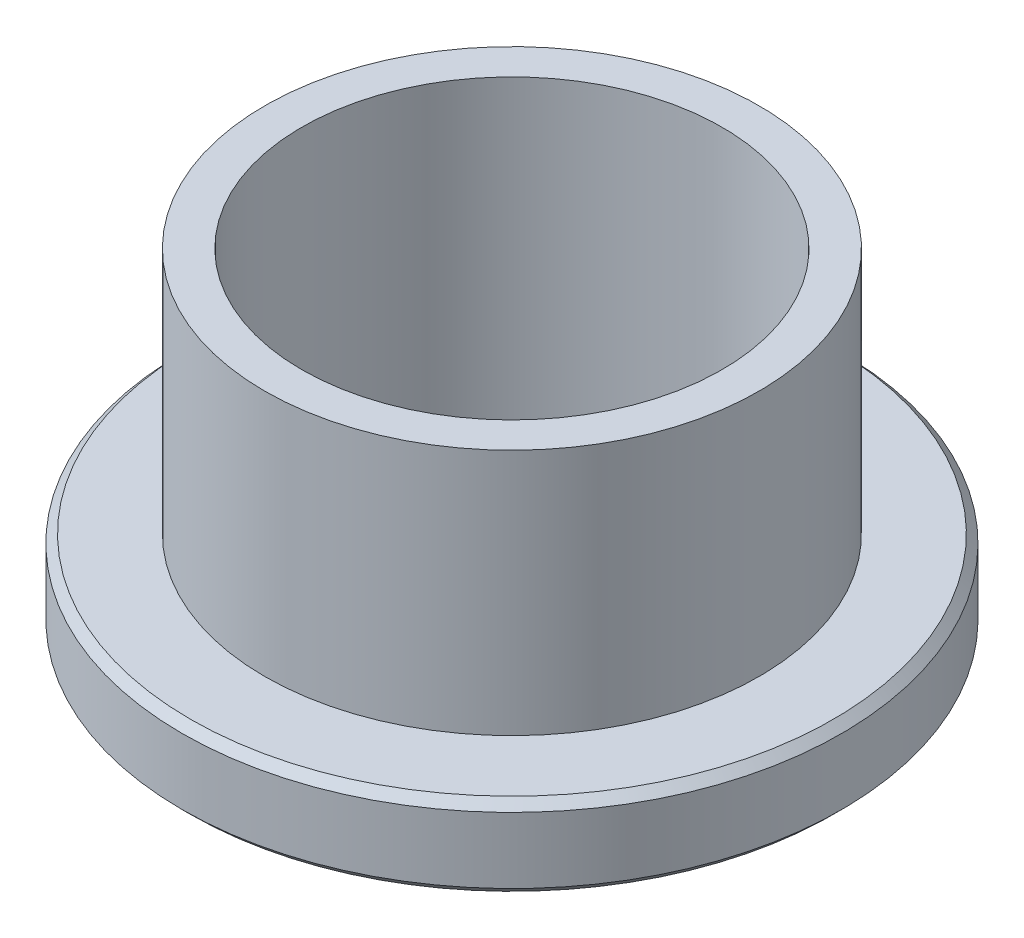
ISO-10303-21;
HEADER;
FILE_DESCRIPTION(('STEP AP214'),'2;1');
FILE_NAME('part.step','',(''),(''),'','','');
FILE_SCHEMA(('AUTOMOTIVE_DESIGN { 1 0 10303 214 1 1 1 1 }'));
ENDSEC;
DATA;
#1=APPLICATION_CONTEXT('core data for automotive mechanical design processes');
#2=APPLICATION_PROTOCOL_DEFINITION('international standard','automotive_design',2000,#1);
#3=PRODUCT_CONTEXT('',#1,'mechanical');
#4=PRODUCT('Part','Part','',(#3));
#5=PRODUCT_RELATED_PRODUCT_CATEGORY('part','',(#4));
#6=PRODUCT_DEFINITION_FORMATION('','',#4);
#7=PRODUCT_DEFINITION_CONTEXT('part definition',#1,'design');
#8=PRODUCT_DEFINITION('design','',#6,#7);
#9=PRODUCT_DEFINITION_SHAPE('','',#8);
#10=(LENGTH_UNIT() NAMED_UNIT(*) SI_UNIT(.MILLI.,.METRE.));
#11=(NAMED_UNIT(*) PLANE_ANGLE_UNIT() SI_UNIT($,.RADIAN.));
#12=(NAMED_UNIT(*) SI_UNIT($,.STERADIAN.) SOLID_ANGLE_UNIT());
#13=UNCERTAINTY_MEASURE_WITH_UNIT(LENGTH_MEASURE(1.E-05),#10,'distance_accuracy_value','');
#14=(GEOMETRIC_REPRESENTATION_CONTEXT(3) GLOBAL_UNCERTAINTY_ASSIGNED_CONTEXT((#13)) GLOBAL_UNIT_ASSIGNED_CONTEXT((#10,
#11,#12)) REPRESENTATION_CONTEXT('',''));
#15=CARTESIAN_POINT('',(0.,0.,0.));
#16=DIRECTION('',(0.,0.,1.));
#17=DIRECTION('',(1.,0.,0.));
#18=AXIS2_PLACEMENT_3D('',#15,#16,#17);
#19=CARTESIAN_POINT('',(0.,0.1,0.));
#20=DIRECTION('',(0.,1.,0.));
#21=DIRECTION('',(0.,0.,1.));
#22=AXIS2_PLACEMENT_3D('',#19,#20,#21);
#23=CONICAL_SURFACE('',#22,4.,0.785398163397448);
#24=CARTESIAN_POINT('',(0.,0.,0.));
#25=DIRECTION('',(0.,-1.,0.));
#26=DIRECTION('',(0.,0.,1.));
#27=AXIS2_PLACEMENT_3D('',#24,#25,#26);
#28=CIRCLE('',#27,3.9);
#29=CARTESIAN_POINT('',(0.,0.,3.9));
#30=VERTEX_POINT('',#29);
#31=EDGE_CURVE('E67',#30,#30,#28,.T.);
#32=ORIENTED_EDGE('',*,*,#31,.F.);
#33=EDGE_LOOP('',(#32));
#34=FACE_BOUND('',#33,.T.);
#35=CARTESIAN_POINT('',(0.,0.1,0.));
#36=DIRECTION('',(0.,1.,0.));
#37=DIRECTION('',(0.,0.,1.));
#38=AXIS2_PLACEMENT_3D('',#35,#36,#37);
#39=CIRCLE('',#38,4.);
#40=CARTESIAN_POINT('',(0.,0.1,4.));
#41=VERTEX_POINT('',#40);
#42=EDGE_CURVE('E85',#41,#41,#39,.T.);
#43=ORIENTED_EDGE('',*,*,#42,.F.);
#44=EDGE_LOOP('',(#43));
#45=FACE_BOUND('',#44,.T.);
#46=ADVANCED_FACE('F17',(#34,#45),#23,.T.);
#47=CARTESIAN_POINT('',(0.,1.,0.));
#48=DIRECTION('',(0.,-1.,0.));
#49=DIRECTION('',(0.,0.,-1.));
#50=AXIS2_PLACEMENT_3D('',#47,#48,#49);
#51=CONICAL_SURFACE('',#50,3.9,0.785398163397457);
#52=CARTESIAN_POINT('',(0.,1.,0.));
#53=DIRECTION('',(0.,1.,0.));
#54=DIRECTION('',(0.,0.,1.));
#55=AXIS2_PLACEMENT_3D('',#52,#53,#54);
#56=CIRCLE('',#55,3.9);
#57=CARTESIAN_POINT('',(0.,1.,3.9));
#58=VERTEX_POINT('',#57);
#59=EDGE_CURVE('E79',#58,#58,#56,.T.);
#60=ORIENTED_EDGE('',*,*,#59,.F.);
#61=EDGE_LOOP('',(#60));
#62=FACE_BOUND('',#61,.T.);
#63=CARTESIAN_POINT('',(0.,0.9,0.));
#64=DIRECTION('',(0.,-1.,0.));
#65=DIRECTION('',(0.,0.,1.));
#66=AXIS2_PLACEMENT_3D('',#63,#64,#65);
#67=CIRCLE('',#66,4.);
#68=CARTESIAN_POINT('',(0.,0.9,4.));
#69=VERTEX_POINT('',#68);
#70=EDGE_CURVE('E82',#69,#69,#67,.T.);
#71=ORIENTED_EDGE('',*,*,#70,.F.);
#72=EDGE_LOOP('',(#71));
#73=FACE_BOUND('',#72,.T.);
#74=ADVANCED_FACE('F95',(#62,#73),#51,.T.);
#75=CARTESIAN_POINT('',(0.,0.,0.));
#76=DIRECTION('',(0.,1.,0.));
#77=DIRECTION('',(0.,0.,1.));
#78=AXIS2_PLACEMENT_3D('',#75,#76,#77);
#79=CYLINDRICAL_SURFACE('',#78,2.55);
#80=CARTESIAN_POINT('',(0.,0.,0.));
#81=DIRECTION('',(0.,1.,0.));
#82=DIRECTION('',(0.,0.,1.));
#83=AXIS2_PLACEMENT_3D('',#80,#81,#82);
#84=CIRCLE('',#83,2.55);
#85=CARTESIAN_POINT('',(0.,0.,2.55));
#86=VERTEX_POINT('',#85);
#87=EDGE_CURVE('E62',#86,#86,#84,.T.);
#88=ORIENTED_EDGE('',*,*,#87,.F.);
#89=EDGE_LOOP('',(#88));
#90=FACE_BOUND('',#89,.T.);
#91=CARTESIAN_POINT('',(0.,4.,0.));
#92=DIRECTION('',(0.,1.,0.));
#93=DIRECTION('',(0.,0.,1.));
#94=AXIS2_PLACEMENT_3D('',#91,#92,#93);
#95=CIRCLE('',#94,2.55);
#96=CARTESIAN_POINT('',(0.,4.,2.55));
#97=VERTEX_POINT('',#96);
#98=EDGE_CURVE('E11',#97,#97,#95,.T.);
#99=ORIENTED_EDGE('',*,*,#98,.T.);
#100=EDGE_LOOP('',(#99));
#101=FACE_BOUND('',#100,.T.);
#102=ADVANCED_FACE('F102',(#90,#101),#79,.F.);
#103=CARTESIAN_POINT('',(0.,4.,0.));
#104=DIRECTION('',(0.,1.,0.));
#105=DIRECTION('',(1.,0.,0.));
#106=AXIS2_PLACEMENT_3D('',#103,#104,#105);
#107=PLANE('',#106);
#108=ORIENTED_EDGE('',*,*,#98,.F.);
#109=EDGE_LOOP('',(#108));
#110=FACE_BOUND('',#109,.T.);
#111=CARTESIAN_POINT('',(0.,4.,0.));
#112=DIRECTION('',(0.,1.,0.));
#113=DIRECTION('',(0.,0.,1.));
#114=AXIS2_PLACEMENT_3D('',#111,#112,#113);
#115=CIRCLE('',#114,3.);
#116=CARTESIAN_POINT('',(0.,4.,3.));
#117=VERTEX_POINT('',#116);
#118=EDGE_CURVE('E26',#117,#117,#115,.T.);
#119=ORIENTED_EDGE('',*,*,#118,.T.);
#120=EDGE_LOOP('',(#119));
#121=FACE_BOUND('',#120,.T.);
#122=ADVANCED_FACE('F116',(#110,#121),#107,.T.);
#123=CARTESIAN_POINT('',(0.,4.,0.));
#124=DIRECTION('',(0.,-1.,0.));
#125=DIRECTION('',(0.,0.,-1.));
#126=AXIS2_PLACEMENT_3D('',#123,#124,#125);
#127=CYLINDRICAL_SURFACE('',#126,3.);
#128=ORIENTED_EDGE('',*,*,#118,.F.);
#129=EDGE_LOOP('',(#128));
#130=FACE_BOUND('',#129,.T.);
#131=CARTESIAN_POINT('',(0.,1.,0.));
#132=DIRECTION('',(0.,1.,0.));
#133=DIRECTION('',(0.,0.,1.));
#134=AXIS2_PLACEMENT_3D('',#131,#132,#133);
#135=CIRCLE('',#134,3.);
#136=CARTESIAN_POINT('',(0.,1.,3.));
#137=VERTEX_POINT('',#136);
#138=EDGE_CURVE('E74',#137,#137,#135,.T.);
#139=ORIENTED_EDGE('',*,*,#138,.T.);
#140=EDGE_LOOP('',(#139));
#141=FACE_BOUND('',#140,.T.);
#142=ADVANCED_FACE('F107',(#130,#141),#127,.T.);
#143=CARTESIAN_POINT('',(0.,0.,0.));
#144=DIRECTION('',(0.,1.,0.));
#145=DIRECTION('',(1.,0.,0.));
#146=AXIS2_PLACEMENT_3D('',#143,#144,#145);
#147=PLANE('',#146);
#148=ORIENTED_EDGE('',*,*,#87,.T.);
#149=EDGE_LOOP('',(#148));
#150=FACE_BOUND('',#149,.T.);
#151=ORIENTED_EDGE('',*,*,#31,.T.);
#152=EDGE_LOOP('',(#151));
#153=FACE_BOUND('',#152,.T.);
#154=ADVANCED_FACE('F63',(#150,#153),#147,.F.);
#155=CARTESIAN_POINT('',(0.,1.,0.));
#156=DIRECTION('',(0.,1.,0.));
#157=DIRECTION('',(1.,0.,0.));
#158=AXIS2_PLACEMENT_3D('',#155,#156,#157);
#159=PLANE('',#158);
#160=ORIENTED_EDGE('',*,*,#138,.F.);
#161=EDGE_LOOP('',(#160));
#162=FACE_BOUND('',#161,.T.);
#163=ORIENTED_EDGE('',*,*,#59,.T.);
#164=EDGE_LOOP('',(#163));
#165=FACE_BOUND('',#164,.T.);
#166=ADVANCED_FACE('F106',(#162,#165),#159,.T.);
#167=CARTESIAN_POINT('',(0.,1.,0.));
#168=DIRECTION('',(0.,-1.,0.));
#169=DIRECTION('',(0.,0.,-1.));
#170=AXIS2_PLACEMENT_3D('',#167,#168,#169);
#171=CYLINDRICAL_SURFACE('',#170,4.);
#172=ORIENTED_EDGE('',*,*,#70,.T.);
#173=EDGE_LOOP('',(#172));
#174=FACE_BOUND('',#173,.T.);
#175=ORIENTED_EDGE('',*,*,#42,.T.);
#176=EDGE_LOOP('',(#175));
#177=FACE_BOUND('',#176,.T.);
#178=ADVANCED_FACE('F92',(#174,#177),#171,.T.);
#179=CLOSED_SHELL('',(#46,#74,#102,#122,#142,#154,#166,#178));
#180=MANIFOLD_SOLID_BREP('B1',#179);
#181=ADVANCED_BREP_SHAPE_REPRESENTATION('',(#18,#180),#14);
#182=SHAPE_DEFINITION_REPRESENTATION(#9,#181);
ENDSEC;
END-ISO-10303-21;
